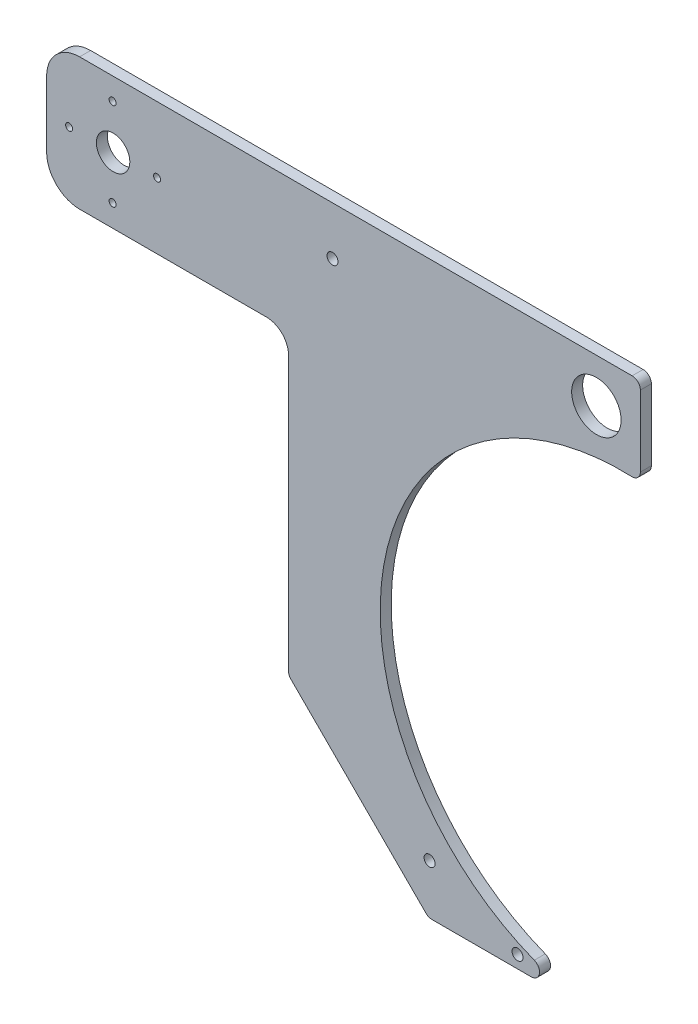
ISO-10303-21;
HEADER;
FILE_DESCRIPTION(('STEP AP214'),'2;1');
FILE_NAME('part.step','',(''),(''),'','','');
FILE_SCHEMA(('AUTOMOTIVE_DESIGN { 1 0 10303 214 1 1 1 1 }'));
ENDSEC;
DATA;
#1=APPLICATION_CONTEXT('core data for automotive mechanical design processes');
#2=APPLICATION_PROTOCOL_DEFINITION('international standard','automotive_design',2000,#1);
#3=PRODUCT_CONTEXT('',#1,'mechanical');
#4=PRODUCT('Part','Part','',(#3));
#5=PRODUCT_RELATED_PRODUCT_CATEGORY('part','',(#4));
#6=PRODUCT_DEFINITION_FORMATION('','',#4);
#7=PRODUCT_DEFINITION_CONTEXT('part definition',#1,'design');
#8=PRODUCT_DEFINITION('design','',#6,#7);
#9=PRODUCT_DEFINITION_SHAPE('','',#8);
#10=(LENGTH_UNIT() NAMED_UNIT(*) SI_UNIT(.MILLI.,.METRE.));
#11=(NAMED_UNIT(*) PLANE_ANGLE_UNIT() SI_UNIT($,.RADIAN.));
#12=(NAMED_UNIT(*) SI_UNIT($,.STERADIAN.) SOLID_ANGLE_UNIT());
#13=UNCERTAINTY_MEASURE_WITH_UNIT(LENGTH_MEASURE(1.E-05),#10,'distance_accuracy_value','');
#14=(GEOMETRIC_REPRESENTATION_CONTEXT(3) GLOBAL_UNCERTAINTY_ASSIGNED_CONTEXT((#13)) GLOBAL_UNIT_ASSIGNED_CONTEXT((#10,
#11,#12)) REPRESENTATION_CONTEXT('',''));
#15=CARTESIAN_POINT('',(0.,0.,0.));
#16=DIRECTION('',(0.,0.,1.));
#17=DIRECTION('',(1.,0.,0.));
#18=AXIS2_PLACEMENT_3D('',#15,#16,#17);
#19=CARTESIAN_POINT('',(0.,248.92,6.35));
#20=DIRECTION('',(0.,1.,0.));
#21=DIRECTION('',(0.,0.,1.));
#22=AXIS2_PLACEMENT_3D('',#19,#20,#21);
#23=PLANE('',#22);
#24=DIRECTION('',(1.,0.,0.));
#25=VECTOR('',#24,1.);
#26=CARTESIAN_POINT('',(0.,248.92,0.));
#27=LINE('',#26,#25);
#28=CARTESIAN_POINT('',(-120.65,248.92,0.));
#29=VERTEX_POINT('',#28);
#30=CARTESIAN_POINT('',(198.4375,248.92,0.));
#31=VERTEX_POINT('',#30);
#32=EDGE_CURVE('E207',#29,#31,#27,.T.);
#33=ORIENTED_EDGE('',*,*,#32,.F.);
#34=DIRECTION('',(0.,0.,-1.));
#35=VECTOR('',#34,1.);
#36=CARTESIAN_POINT('',(-120.65,248.92,6.35));
#37=LINE('',#36,#35);
#38=CARTESIAN_POINT('',(-120.65,248.92,6.35));
#39=VERTEX_POINT('',#38);
#40=EDGE_CURVE('E11',#39,#29,#37,.T.);
#41=ORIENTED_EDGE('',*,*,#40,.F.);
#42=DIRECTION('',(1.,0.,0.));
#43=VECTOR('',#42,1.);
#44=CARTESIAN_POINT('',(0.,248.92,6.35));
#45=LINE('',#44,#43);
#46=CARTESIAN_POINT('',(198.4375,248.92,6.35));
#47=VERTEX_POINT('',#46);
#48=EDGE_CURVE('E328',#39,#47,#45,.T.);
#49=ORIENTED_EDGE('',*,*,#48,.T.);
#50=DIRECTION('',(0.,0.,-1.));
#51=VECTOR('',#50,1.);
#52=CARTESIAN_POINT('',(198.4375,248.92,6.35));
#53=LINE('',#52,#51);
#54=EDGE_CURVE('E112',#47,#31,#53,.T.);
#55=ORIENTED_EDGE('',*,*,#54,.T.);
#56=EDGE_LOOP('',(#33,#41,#49,#55));
#57=FACE_BOUND('',#56,.T.);
#58=ADVANCED_FACE('F37',(#57),#23,.T.);
#59=CARTESIAN_POINT('',(-120.65,229.87,6.35));
#60=DIRECTION('',(0.,0.,-1.));
#61=DIRECTION('',(-1.,0.,0.));
#62=AXIS2_PLACEMENT_3D('',#59,#60,#61);
#63=CYLINDRICAL_SURFACE('',#62,19.05);
#64=CARTESIAN_POINT('',(-120.65,229.87,0.));
#65=DIRECTION('',(0.,0.,1.));
#66=DIRECTION('',(1.,0.,0.));
#67=AXIS2_PLACEMENT_3D('',#64,#65,#66);
#68=CIRCLE('',#67,19.05);
#69=CARTESIAN_POINT('',(-139.7,229.87,0.));
#70=VERTEX_POINT('',#69);
#71=EDGE_CURVE('E210',#29,#70,#68,.T.);
#72=ORIENTED_EDGE('',*,*,#71,.T.);
#73=DIRECTION('',(0.,0.,-1.));
#74=VECTOR('',#73,1.);
#75=CARTESIAN_POINT('',(-139.7,229.87,6.35));
#76=LINE('',#75,#74);
#77=CARTESIAN_POINT('',(-139.7,229.87,6.35));
#78=VERTEX_POINT('',#77);
#79=EDGE_CURVE('E46',#78,#70,#76,.T.);
#80=ORIENTED_EDGE('',*,*,#79,.F.);
#81=CARTESIAN_POINT('',(-120.65,229.87,6.35));
#82=DIRECTION('',(0.,0.,1.));
#83=DIRECTION('',(1.,0.,0.));
#84=AXIS2_PLACEMENT_3D('',#81,#82,#83);
#85=CIRCLE('',#84,19.05);
#86=EDGE_CURVE('E326',#39,#78,#85,.T.);
#87=ORIENTED_EDGE('',*,*,#86,.F.);
#88=ORIENTED_EDGE('',*,*,#40,.T.);
#89=EDGE_LOOP('',(#72,#80,#87,#88));
#90=FACE_BOUND('',#89,.T.);
#91=ADVANCED_FACE('F311',(#90),#63,.T.);
#92=CARTESIAN_POINT('',(-139.7,0.,6.35));
#93=DIRECTION('',(-1.,0.,0.));
#94=DIRECTION('',(0.,0.,1.));
#95=AXIS2_PLACEMENT_3D('',#92,#93,#94);
#96=PLANE('',#95);
#97=DIRECTION('',(0.,1.,0.));
#98=VECTOR('',#97,1.);
#99=CARTESIAN_POINT('',(-139.7,0.,0.));
#100=LINE('',#99,#98);
#101=CARTESIAN_POINT('',(-139.7,191.77,0.));
#102=VERTEX_POINT('',#101);
#103=EDGE_CURVE('E213',#102,#70,#100,.T.);
#104=ORIENTED_EDGE('',*,*,#103,.F.);
#105=DIRECTION('',(0.,0.,-1.));
#106=VECTOR('',#105,1.);
#107=CARTESIAN_POINT('',(-139.7,191.77,6.35));
#108=LINE('',#107,#106);
#109=CARTESIAN_POINT('',(-139.7,191.77,6.35));
#110=VERTEX_POINT('',#109);
#111=EDGE_CURVE('E301',#110,#102,#108,.T.);
#112=ORIENTED_EDGE('',*,*,#111,.F.);
#113=DIRECTION('',(0.,1.,0.));
#114=VECTOR('',#113,1.);
#115=CARTESIAN_POINT('',(-139.7,0.,6.35));
#116=LINE('',#115,#114);
#117=EDGE_CURVE('E308',#110,#78,#116,.T.);
#118=ORIENTED_EDGE('',*,*,#117,.T.);
#119=ORIENTED_EDGE('',*,*,#79,.T.);
#120=EDGE_LOOP('',(#104,#112,#118,#119));
#121=FACE_BOUND('',#120,.T.);
#122=ADVANCED_FACE('F306',(#121),#96,.T.);
#123=CARTESIAN_POINT('',(-120.65,191.77,6.35));
#124=DIRECTION('',(0.,0.,-1.));
#125=DIRECTION('',(-1.,0.,0.));
#126=AXIS2_PLACEMENT_3D('',#123,#124,#125);
#127=CYLINDRICAL_SURFACE('',#126,19.05);
#128=CARTESIAN_POINT('',(-120.65,191.77,0.));
#129=DIRECTION('',(0.,0.,1.));
#130=DIRECTION('',(1.,0.,0.));
#131=AXIS2_PLACEMENT_3D('',#128,#129,#130);
#132=CIRCLE('',#131,19.05);
#133=CARTESIAN_POINT('',(-120.65,172.72,0.));
#134=VERTEX_POINT('',#133);
#135=EDGE_CURVE('E216',#102,#134,#132,.T.);
#136=ORIENTED_EDGE('',*,*,#135,.T.);
#137=DIRECTION('',(0.,0.,-1.));
#138=VECTOR('',#137,1.);
#139=CARTESIAN_POINT('',(-120.65,172.72,6.35));
#140=LINE('',#139,#138);
#141=CARTESIAN_POINT('',(-120.65,172.72,6.35));
#142=VERTEX_POINT('',#141);
#143=EDGE_CURVE('E299',#142,#134,#140,.T.);
#144=ORIENTED_EDGE('',*,*,#143,.F.);
#145=CARTESIAN_POINT('',(-120.65,191.77,6.35));
#146=DIRECTION('',(0.,0.,1.));
#147=DIRECTION('',(1.,0.,0.));
#148=AXIS2_PLACEMENT_3D('',#145,#146,#147);
#149=CIRCLE('',#148,19.05);
#150=EDGE_CURVE('E322',#110,#142,#149,.T.);
#151=ORIENTED_EDGE('',*,*,#150,.F.);
#152=ORIENTED_EDGE('',*,*,#111,.T.);
#153=EDGE_LOOP('',(#136,#144,#151,#152));
#154=FACE_BOUND('',#153,.T.);
#155=ADVANCED_FACE('F319',(#154),#127,.T.);
#156=CARTESIAN_POINT('',(0.,172.72,6.35));
#157=DIRECTION('',(0.,-1.,0.));
#158=DIRECTION('',(0.,0.,-1.));
#159=AXIS2_PLACEMENT_3D('',#156,#157,#158);
#160=PLANE('',#159);
#161=DIRECTION('',(-1.,0.,0.));
#162=VECTOR('',#161,1.);
#163=CARTESIAN_POINT('',(0.,172.72,0.));
#164=LINE('',#163,#162);
#165=CARTESIAN_POINT('',(-12.7,172.72,0.));
#166=VERTEX_POINT('',#165);
#167=EDGE_CURVE('E219',#166,#134,#164,.T.);
#168=ORIENTED_EDGE('',*,*,#167,.F.);
#169=DIRECTION('',(0.,0.,-1.));
#170=VECTOR('',#169,1.);
#171=CARTESIAN_POINT('',(-12.7,172.72,6.35));
#172=LINE('',#171,#170);
#173=CARTESIAN_POINT('',(-12.7,172.72,6.35));
#174=VERTEX_POINT('',#173);
#175=EDGE_CURVE('E297',#174,#166,#172,.T.);
#176=ORIENTED_EDGE('',*,*,#175,.F.);
#177=DIRECTION('',(-1.,0.,0.));
#178=VECTOR('',#177,1.);
#179=CARTESIAN_POINT('',(0.,172.72,6.35));
#180=LINE('',#179,#178);
#181=EDGE_CURVE('E324',#174,#142,#180,.T.);
#182=ORIENTED_EDGE('',*,*,#181,.T.);
#183=ORIENTED_EDGE('',*,*,#143,.T.);
#184=EDGE_LOOP('',(#168,#176,#182,#183));
#185=FACE_BOUND('',#184,.T.);
#186=ADVANCED_FACE('F386',(#185),#160,.T.);
#187=CARTESIAN_POINT('',(-12.7,160.02,6.35));
#188=DIRECTION('',(0.,0.,-1.));
#189=DIRECTION('',(-1.,0.,0.));
#190=AXIS2_PLACEMENT_3D('',#187,#188,#189);
#191=CYLINDRICAL_SURFACE('',#190,12.7);
#192=CARTESIAN_POINT('',(-12.7,160.02,0.));
#193=DIRECTION('',(0.,0.,1.));
#194=DIRECTION('',(1.,0.,0.));
#195=AXIS2_PLACEMENT_3D('',#192,#193,#194);
#196=CIRCLE('',#195,12.7);
#197=CARTESIAN_POINT('',(0.,160.02,0.));
#198=VERTEX_POINT('',#197);
#199=EDGE_CURVE('E222',#198,#166,#196,.T.);
#200=ORIENTED_EDGE('',*,*,#199,.F.);
#201=DIRECTION('',(0.,0.,-1.));
#202=VECTOR('',#201,1.);
#203=CARTESIAN_POINT('',(0.,160.02,6.35));
#204=LINE('',#203,#202);
#205=CARTESIAN_POINT('',(0.,160.02,6.35));
#206=VERTEX_POINT('',#205);
#207=EDGE_CURVE('E295',#206,#198,#204,.T.);
#208=ORIENTED_EDGE('',*,*,#207,.F.);
#209=CARTESIAN_POINT('',(-12.7,160.02,6.35));
#210=DIRECTION('',(0.,0.,1.));
#211=DIRECTION('',(1.,0.,0.));
#212=AXIS2_PLACEMENT_3D('',#209,#210,#211);
#213=CIRCLE('',#212,12.7);
#214=EDGE_CURVE('E333',#206,#174,#213,.T.);
#215=ORIENTED_EDGE('',*,*,#214,.T.);
#216=ORIENTED_EDGE('',*,*,#175,.T.);
#217=EDGE_LOOP('',(#200,#208,#215,#216));
#218=FACE_BOUND('',#217,.T.);
#219=ADVANCED_FACE('F389',(#218),#191,.F.);
#220=CARTESIAN_POINT('',(0.,0.,6.35));
#221=DIRECTION('',(-1.,0.,0.));
#222=DIRECTION('',(0.,0.,1.));
#223=AXIS2_PLACEMENT_3D('',#220,#221,#222);
#224=PLANE('',#223);
#225=DIRECTION('',(0.,1.,0.));
#226=VECTOR('',#225,1.);
#227=CARTESIAN_POINT('',(0.,0.,0.));
#228=LINE('',#227,#226);
#229=CARTESIAN_POINT('',(0.,1.97269209080185,0.));
#230=VERTEX_POINT('',#229);
#231=EDGE_CURVE('E225',#230,#198,#228,.T.);
#232=ORIENTED_EDGE('',*,*,#231,.F.);
#233=DIRECTION('',(0.,0.,-1.));
#234=VECTOR('',#233,1.);
#235=CARTESIAN_POINT('',(0.,1.97269209080185,6.35));
#236=LINE('',#235,#234);
#237=CARTESIAN_POINT('',(0.,1.97269209080185,6.35));
#238=VERTEX_POINT('',#237);
#239=EDGE_CURVE('E293',#238,#230,#236,.T.);
#240=ORIENTED_EDGE('',*,*,#239,.F.);
#241=DIRECTION('',(0.,1.,0.));
#242=VECTOR('',#241,1.);
#243=CARTESIAN_POINT('',(0.,0.,6.35));
#244=LINE('',#243,#242);
#245=EDGE_CURVE('E336',#238,#206,#244,.T.);
#246=ORIENTED_EDGE('',*,*,#245,.T.);
#247=ORIENTED_EDGE('',*,*,#207,.T.);
#248=EDGE_LOOP('',(#232,#240,#246,#247));
#249=FACE_BOUND('',#248,.T.);
#250=ADVANCED_FACE('F393',(#249),#224,.T.);
#251=CARTESIAN_POINT('',(4.7625,1.97269209080185,6.35));
#252=DIRECTION('',(0.,0.,-1.));
#253=DIRECTION('',(-1.,0.,0.));
#254=AXIS2_PLACEMENT_3D('',#251,#252,#253);
#255=CYLINDRICAL_SURFACE('',#254,4.7625);
#256=CARTESIAN_POINT('',(4.7625,1.97269209080185,0.));
#257=DIRECTION('',(0.,0.,1.));
#258=DIRECTION('',(1.,0.,0.));
#259=AXIS2_PLACEMENT_3D('',#256,#257,#258);
#260=CIRCLE('',#259,4.7625);
#261=CARTESIAN_POINT('',(1.39490395459905,-1.39490395459906,0.));
#262=VERTEX_POINT('',#261);
#263=EDGE_CURVE('E228',#262,#230,#260,.F.);
#264=ORIENTED_EDGE('',*,*,#263,.F.);
#265=DIRECTION('',(0.,0.,-1.));
#266=VECTOR('',#265,1.);
#267=CARTESIAN_POINT('',(1.39490395459905,-1.39490395459906,6.35));
#268=LINE('',#267,#266);
#269=CARTESIAN_POINT('',(1.39490395459905,-1.39490395459906,6.35));
#270=VERTEX_POINT('',#269);
#271=EDGE_CURVE('E291',#270,#262,#268,.T.);
#272=ORIENTED_EDGE('',*,*,#271,.F.);
#273=CARTESIAN_POINT('',(4.7625,1.97269209080185,6.35));
#274=DIRECTION('',(0.,0.,1.));
#275=DIRECTION('',(1.,0.,0.));
#276=AXIS2_PLACEMENT_3D('',#273,#274,#275);
#277=CIRCLE('',#276,4.7625);
#278=EDGE_CURVE('E339',#270,#238,#277,.F.);
#279=ORIENTED_EDGE('',*,*,#278,.T.);
#280=ORIENTED_EDGE('',*,*,#239,.T.);
#281=EDGE_LOOP('',(#264,#272,#279,#280));
#282=FACE_BOUND('',#281,.T.);
#283=ADVANCED_FACE('F397',(#282),#255,.T.);
#284=CARTESIAN_POINT('',(0.,0.,6.35));
#285=DIRECTION('',(0.707106781186551,0.707106781186544,0.));
#286=DIRECTION('',(-0.707106781186544,0.707106781186551,0.));
#287=AXIS2_PLACEMENT_3D('',#284,#285,#286);
#288=PLANE('',#287);
#289=DIRECTION('',(0.707106781186544,-0.707106781186551,0.));
#290=VECTOR('',#289,1.);
#291=CARTESIAN_POINT('',(0.,0.,0.));
#292=LINE('',#291,#290);
#293=CARTESIAN_POINT('',(79.4274011350229,-79.4274011350237,0.));
#294=VERTEX_POINT('',#293);
#295=EDGE_CURVE('E231',#262,#294,#292,.T.);
#296=ORIENTED_EDGE('',*,*,#295,.T.);
#297=DIRECTION('',(0.,0.,-1.));
#298=VECTOR('',#297,1.);
#299=CARTESIAN_POINT('',(79.4274011350229,-79.4274011350237,6.35));
#300=LINE('',#299,#298);
#301=CARTESIAN_POINT('',(79.4274011350229,-79.4274011350237,6.35));
#302=VERTEX_POINT('',#301);
#303=EDGE_CURVE('E288',#302,#294,#300,.T.);
#304=ORIENTED_EDGE('',*,*,#303,.F.);
#305=DIRECTION('',(0.707106781186544,-0.707106781186551,0.));
#306=VECTOR('',#305,1.);
#307=CARTESIAN_POINT('',(0.,0.,6.35));
#308=LINE('',#307,#306);
#309=EDGE_CURVE('E342',#270,#302,#308,.T.);
#310=ORIENTED_EDGE('',*,*,#309,.F.);
#311=ORIENTED_EDGE('',*,*,#271,.T.);
#312=EDGE_LOOP('',(#296,#304,#310,#311));
#313=FACE_BOUND('',#312,.T.);
#314=ADVANCED_FACE('F401',(#313),#288,.F.);
#315=CARTESIAN_POINT('',(82.7949971804238,-76.0598050896228,6.35));
#316=DIRECTION('',(0.,0.,-1.));
#317=DIRECTION('',(-1.,0.,0.));
#318=AXIS2_PLACEMENT_3D('',#315,#316,#317);
#319=CYLINDRICAL_SURFACE('',#318,4.76250000000001);
#320=CARTESIAN_POINT('',(82.7949971804238,-76.0598050896228,0.));
#321=DIRECTION('',(0.,0.,1.));
#322=DIRECTION('',(1.,0.,0.));
#323=AXIS2_PLACEMENT_3D('',#320,#321,#322);
#324=CIRCLE('',#323,4.76250000000001);
#325=CARTESIAN_POINT('',(82.7949971804238,-80.8223050896228,0.));
#326=VERTEX_POINT('',#325);
#327=EDGE_CURVE('E234',#294,#326,#324,.T.);
#328=ORIENTED_EDGE('',*,*,#327,.T.);
#329=DIRECTION('',(0.,0.,-1.));
#330=VECTOR('',#329,1.);
#331=CARTESIAN_POINT('',(82.7949971804238,-80.8223050896228,6.35));
#332=LINE('',#331,#330);
#333=CARTESIAN_POINT('',(82.7949971804238,-80.8223050896228,6.35));
#334=VERTEX_POINT('',#333);
#335=EDGE_CURVE('E285',#334,#326,#332,.T.);
#336=ORIENTED_EDGE('',*,*,#335,.F.);
#337=CARTESIAN_POINT('',(82.7949971804238,-76.0598050896228,6.35));
#338=DIRECTION('',(0.,0.,1.));
#339=DIRECTION('',(1.,0.,0.));
#340=AXIS2_PLACEMENT_3D('',#337,#338,#339);
#341=CIRCLE('',#340,4.76250000000001);
#342=EDGE_CURVE('E345',#302,#334,#341,.T.);
#343=ORIENTED_EDGE('',*,*,#342,.F.);
#344=ORIENTED_EDGE('',*,*,#303,.T.);
#345=EDGE_LOOP('',(#328,#336,#343,#344));
#346=FACE_BOUND('',#345,.T.);
#347=ADVANCED_FACE('F405',(#346),#319,.T.);
#348=CARTESIAN_POINT('',(0.,-80.8223050896228,6.35));
#349=DIRECTION('',(0.,1.,0.));
#350=DIRECTION('',(0.,0.,1.));
#351=AXIS2_PLACEMENT_3D('',#348,#349,#350);
#352=PLANE('',#351);
#353=DIRECTION('',(1.,0.,0.));
#354=VECTOR('',#353,1.);
#355=CARTESIAN_POINT('',(0.,-80.8223050896228,0.));
#356=LINE('',#355,#354);
#357=CARTESIAN_POINT('',(140.194292931709,-80.8223050896228,0.));
#358=VERTEX_POINT('',#357);
#359=EDGE_CURVE('E237',#326,#358,#356,.T.);
#360=ORIENTED_EDGE('',*,*,#359,.T.);
#361=DIRECTION('',(0.,0.,-1.));
#362=VECTOR('',#361,1.);
#363=CARTESIAN_POINT('',(140.194292931709,-80.8223050896228,6.35));
#364=LINE('',#363,#362);
#365=CARTESIAN_POINT('',(140.194292931709,-80.8223050896228,6.35));
#366=VERTEX_POINT('',#365);
#367=EDGE_CURVE('E282',#366,#358,#364,.T.);
#368=ORIENTED_EDGE('',*,*,#367,.F.);
#369=DIRECTION('',(1.,0.,0.));
#370=VECTOR('',#369,1.);
#371=CARTESIAN_POINT('',(0.,-80.8223050896228,6.35));
#372=LINE('',#371,#370);
#373=EDGE_CURVE('E348',#334,#366,#372,.T.);
#374=ORIENTED_EDGE('',*,*,#373,.F.);
#375=ORIENTED_EDGE('',*,*,#335,.T.);
#376=EDGE_LOOP('',(#360,#368,#374,#375));
#377=FACE_BOUND('',#376,.T.);
#378=ADVANCED_FACE('F409',(#377),#352,.F.);
#379=CARTESIAN_POINT('',(140.194292931709,-76.0598050896228,6.35));
#380=DIRECTION('',(0.,0.,-1.));
#381=DIRECTION('',(-1.,0.,0.));
#382=AXIS2_PLACEMENT_3D('',#379,#380,#381);
#383=CYLINDRICAL_SURFACE('',#382,4.76250000000001);
#384=CARTESIAN_POINT('',(140.194292931709,-76.0598050896228,0.));
#385=DIRECTION('',(0.,0.,1.));
#386=DIRECTION('',(1.,0.,0.));
#387=AXIS2_PLACEMENT_3D('',#384,#385,#386);
#388=CIRCLE('',#387,4.76250000000001);
#389=CARTESIAN_POINT('',(141.927025129819,-71.6236980823884,0.));
#390=VERTEX_POINT('',#389);
#391=EDGE_CURVE('E240',#358,#390,#388,.T.);
#392=ORIENTED_EDGE('',*,*,#391,.T.);
#393=DIRECTION('',(0.,0.,-1.));
#394=VECTOR('',#393,1.);
#395=CARTESIAN_POINT('',(141.927025129819,-71.6236980823884,6.35));
#396=LINE('',#395,#394);
#397=CARTESIAN_POINT('',(141.927025129819,-71.6236980823884,6.35));
#398=VERTEX_POINT('',#397);
#399=EDGE_CURVE('E279',#398,#390,#396,.T.);
#400=ORIENTED_EDGE('',*,*,#399,.F.);
#401=CARTESIAN_POINT('',(140.194292931709,-76.0598050896228,6.35));
#402=DIRECTION('',(0.,0.,1.));
#403=DIRECTION('',(1.,0.,0.));
#404=AXIS2_PLACEMENT_3D('',#401,#402,#403);
#405=CIRCLE('',#404,4.76250000000001);
#406=EDGE_CURVE('E351',#366,#398,#405,.T.);
#407=ORIENTED_EDGE('',*,*,#406,.F.);
#408=ORIENTED_EDGE('',*,*,#367,.T.);
#409=EDGE_LOOP('',(#392,#400,#407,#408));
#410=FACE_BOUND('',#409,.T.);
#411=ADVANCED_FACE('F355',(#410),#383,.T.);
#412=CARTESIAN_POINT('',(192.811152544811,58.6488474551886,6.35));
#413=DIRECTION('',(0.,0.,-1.));
#414=DIRECTION('',(-1.,0.,0.));
#415=AXIS2_PLACEMENT_3D('',#412,#413,#414);
#416=CYLINDRICAL_SURFACE('',#415,139.857536599303);
#417=CARTESIAN_POINT('',(192.811152544811,58.6488474551886,0.));
#418=DIRECTION('',(0.,0.,1.));
#419=DIRECTION('',(1.,0.,0.));
#420=AXIS2_PLACEMENT_3D('',#417,#418,#419);
#421=CIRCLE('',#420,139.857536599303);
#422=CARTESIAN_POINT('',(198.252218068219,198.400503436773,0.));
#423=VERTEX_POINT('',#422);
#424=EDGE_CURVE('E243',#390,#423,#421,.F.);
#425=ORIENTED_EDGE('',*,*,#424,.T.);
#426=DIRECTION('',(0.,0.,-1.));
#427=VECTOR('',#426,1.);
#428=CARTESIAN_POINT('',(198.252218068219,198.400503436773,6.35));
#429=LINE('',#428,#427);
#430=CARTESIAN_POINT('',(198.252218068219,198.400503436773,6.35));
#431=VERTEX_POINT('',#430);
#432=EDGE_CURVE('E173',#431,#423,#429,.T.);
#433=ORIENTED_EDGE('',*,*,#432,.F.);
#434=CARTESIAN_POINT('',(192.811152544811,58.6488474551886,6.35));
#435=DIRECTION('',(0.,0.,1.));
#436=DIRECTION('',(1.,0.,0.));
#437=AXIS2_PLACEMENT_3D('',#434,#435,#436);
#438=CIRCLE('',#437,139.857536599303);
#439=EDGE_CURVE('E161',#398,#431,#438,.F.);
#440=ORIENTED_EDGE('',*,*,#439,.F.);
#441=ORIENTED_EDGE('',*,*,#399,.T.);
#442=EDGE_LOOP('',(#425,#433,#440,#441));
#443=FACE_BOUND('',#442,.T.);
#444=ADVANCED_FACE('F357',(#443),#416,.F.);
#445=CARTESIAN_POINT('',(198.4375,203.159397936104,6.35));
#446=DIRECTION('',(0.,0.,-1.));
#447=DIRECTION('',(-1.,0.,0.));
#448=AXIS2_PLACEMENT_3D('',#445,#446,#447);
#449=CYLINDRICAL_SURFACE('',#448,4.76250000000001);
#450=CARTESIAN_POINT('',(198.4375,203.159397936104,0.));
#451=DIRECTION('',(0.,0.,1.));
#452=DIRECTION('',(1.,0.,0.));
#453=AXIS2_PLACEMENT_3D('',#450,#451,#452);
#454=CIRCLE('',#453,4.76250000000001);
#455=CARTESIAN_POINT('',(203.2,203.159397936104,0.));
#456=VERTEX_POINT('',#455);
#457=EDGE_CURVE('E169',#423,#456,#454,.T.);
#458=ORIENTED_EDGE('',*,*,#457,.T.);
#459=DIRECTION('',(0.,0.,-1.));
#460=VECTOR('',#459,1.);
#461=CARTESIAN_POINT('',(203.2,203.159397936104,6.35));
#462=LINE('',#461,#460);
#463=CARTESIAN_POINT('',(203.2,203.159397936104,6.35));
#464=VERTEX_POINT('',#463);
#465=EDGE_CURVE('E167',#464,#456,#462,.T.);
#466=ORIENTED_EDGE('',*,*,#465,.F.);
#467=CARTESIAN_POINT('',(198.4375,203.159397936104,6.35));
#468=DIRECTION('',(0.,0.,1.));
#469=DIRECTION('',(1.,0.,0.));
#470=AXIS2_PLACEMENT_3D('',#467,#468,#469);
#471=CIRCLE('',#470,4.76250000000001);
#472=EDGE_CURVE('E154',#431,#464,#471,.T.);
#473=ORIENTED_EDGE('',*,*,#472,.F.);
#474=ORIENTED_EDGE('',*,*,#432,.T.);
#475=EDGE_LOOP('',(#458,#466,#473,#474));
#476=FACE_BOUND('',#475,.T.);
#477=ADVANCED_FACE('F168',(#476),#449,.T.);
#478=CARTESIAN_POINT('',(203.2,0.,6.35));
#479=DIRECTION('',(1.,0.,0.));
#480=DIRECTION('',(0.,0.,-1.));
#481=AXIS2_PLACEMENT_3D('',#478,#479,#480);
#482=PLANE('',#481);
#483=DIRECTION('',(0.,-1.,0.));
#484=VECTOR('',#483,1.);
#485=CARTESIAN_POINT('',(203.2,0.,0.));
#486=LINE('',#485,#484);
#487=CARTESIAN_POINT('',(203.2,244.1575,0.));
#488=VERTEX_POINT('',#487);
#489=EDGE_CURVE('E247',#488,#456,#486,.T.);
#490=ORIENTED_EDGE('',*,*,#489,.F.);
#491=DIRECTION('',(0.,0.,-1.));
#492=VECTOR('',#491,1.);
#493=CARTESIAN_POINT('',(203.2,244.1575,6.35));
#494=LINE('',#493,#492);
#495=CARTESIAN_POINT('',(203.2,244.1575,6.35));
#496=VERTEX_POINT('',#495);
#497=EDGE_CURVE('E105',#496,#488,#494,.T.);
#498=ORIENTED_EDGE('',*,*,#497,.F.);
#499=DIRECTION('',(0.,-1.,0.));
#500=VECTOR('',#499,1.);
#501=CARTESIAN_POINT('',(203.2,0.,6.35));
#502=LINE('',#501,#500);
#503=EDGE_CURVE('E159',#496,#464,#502,.T.);
#504=ORIENTED_EDGE('',*,*,#503,.T.);
#505=ORIENTED_EDGE('',*,*,#465,.T.);
#506=EDGE_LOOP('',(#490,#498,#504,#505));
#507=FACE_BOUND('',#506,.T.);
#508=ADVANCED_FACE('F175',(#507),#482,.T.);
#509=CARTESIAN_POINT('',(-75.911264173736,210.821094088903,6.35));
#510=DIRECTION('',(0.,0.,-1.));
#511=DIRECTION('',(-1.,0.,0.));
#512=AXIS2_PLACEMENT_3D('',#509,#510,#511);
#513=CYLINDRICAL_SURFACE('',#512,2.032);
#514=CARTESIAN_POINT('',(-75.911264173736,210.821094088903,6.35));
#515=DIRECTION('',(0.,0.,1.));
#516=DIRECTION('',(1.,0.,0.));
#517=AXIS2_PLACEMENT_3D('',#514,#515,#516);
#518=CIRCLE('',#517,2.032);
#519=CARTESIAN_POINT('',(-73.879264173736,210.821094088903,6.35));
#520=VERTEX_POINT('',#519);
#521=EDGE_CURVE('E198',#520,#520,#518,.T.);
#522=ORIENTED_EDGE('',*,*,#521,.T.);
#523=EDGE_LOOP('',(#522));
#524=FACE_BOUND('',#523,.T.);
#525=CARTESIAN_POINT('',(-75.911264173736,210.821094088903,0.));
#526=DIRECTION('',(0.,0.,1.));
#527=DIRECTION('',(1.,0.,0.));
#528=AXIS2_PLACEMENT_3D('',#525,#526,#527);
#529=CIRCLE('',#528,2.032);
#530=CARTESIAN_POINT('',(-73.879264173736,210.821094088903,0.));
#531=VERTEX_POINT('',#530);
#532=EDGE_CURVE('E269',#531,#531,#529,.T.);
#533=ORIENTED_EDGE('',*,*,#532,.F.);
#534=EDGE_LOOP('',(#533));
#535=FACE_BOUND('',#534,.T.);
#536=ADVANCED_FACE('F422',(#524,#535),#513,.F.);
#537=CARTESIAN_POINT('',(-101.311264173736,210.821094088903,6.35));
#538=DIRECTION('',(0.,0.,-1.));
#539=DIRECTION('',(-1.,0.,0.));
#540=AXIS2_PLACEMENT_3D('',#537,#538,#539);
#541=CYLINDRICAL_SURFACE('',#540,9.65199999999999);
#542=CARTESIAN_POINT('',(-101.311264173736,210.821094088903,6.35));
#543=DIRECTION('',(0.,0.,1.));
#544=DIRECTION('',(1.,0.,0.));
#545=AXIS2_PLACEMENT_3D('',#542,#543,#544);
#546=CIRCLE('',#545,9.65199999999999);
#547=CARTESIAN_POINT('',(-91.659264173736,210.821094088903,6.35));
#548=VERTEX_POINT('',#547);
#549=EDGE_CURVE('E195',#548,#548,#546,.T.);
#550=ORIENTED_EDGE('',*,*,#549,.T.);
#551=EDGE_LOOP('',(#550));
#552=FACE_BOUND('',#551,.T.);
#553=CARTESIAN_POINT('',(-101.311264173736,210.821094088903,0.));
#554=DIRECTION('',(0.,0.,1.));
#555=DIRECTION('',(1.,0.,0.));
#556=AXIS2_PLACEMENT_3D('',#553,#554,#555);
#557=CIRCLE('',#556,9.65199999999999);
#558=CARTESIAN_POINT('',(-91.659264173736,210.821094088903,0.));
#559=VERTEX_POINT('',#558);
#560=EDGE_CURVE('E266',#559,#559,#557,.T.);
#561=ORIENTED_EDGE('',*,*,#560,.F.);
#562=EDGE_LOOP('',(#561));
#563=FACE_BOUND('',#562,.T.);
#564=ADVANCED_FACE('F444',(#552,#563),#541,.F.);
#565=CARTESIAN_POINT('',(177.8,223.52,6.35));
#566=DIRECTION('',(0.,0.,-1.));
#567=DIRECTION('',(-1.,0.,0.));
#568=AXIS2_PLACEMENT_3D('',#565,#566,#567);
#569=CYLINDRICAL_SURFACE('',#568,14.2875);
#570=CARTESIAN_POINT('',(177.8,223.52,6.35));
#571=DIRECTION('',(0.,0.,1.));
#572=DIRECTION('',(1.,0.,0.));
#573=AXIS2_PLACEMENT_3D('',#570,#571,#572);
#574=CIRCLE('',#573,14.2875);
#575=CARTESIAN_POINT('',(192.0875,223.52,6.35));
#576=VERTEX_POINT('',#575);
#577=EDGE_CURVE('E192',#576,#576,#574,.T.);
#578=ORIENTED_EDGE('',*,*,#577,.T.);
#579=EDGE_LOOP('',(#578));
#580=FACE_BOUND('',#579,.T.);
#581=CARTESIAN_POINT('',(177.8,223.52,0.));
#582=DIRECTION('',(0.,0.,1.));
#583=DIRECTION('',(1.,0.,0.));
#584=AXIS2_PLACEMENT_3D('',#581,#582,#583);
#585=CIRCLE('',#584,14.2875);
#586=CARTESIAN_POINT('',(192.0875,223.52,0.));
#587=VERTEX_POINT('',#586);
#588=EDGE_CURVE('E263',#587,#587,#585,.T.);
#589=ORIENTED_EDGE('',*,*,#588,.F.);
#590=EDGE_LOOP('',(#589));
#591=FACE_BOUND('',#590,.T.);
#592=ADVANCED_FACE('F440',(#580,#591),#569,.F.);
#593=CARTESIAN_POINT('',(132.256792931709,-73.5198050896228,6.35));
#594=DIRECTION('',(0.,0.,-1.));
#595=DIRECTION('',(-1.,0.,0.));
#596=AXIS2_PLACEMENT_3D('',#593,#594,#595);
#597=CYLINDRICAL_SURFACE('',#596,3.17499999999999);
#598=CARTESIAN_POINT('',(132.256792931709,-73.5198050896228,6.35));
#599=DIRECTION('',(0.,0.,1.));
#600=DIRECTION('',(1.,0.,0.));
#601=AXIS2_PLACEMENT_3D('',#598,#599,#600);
#602=CIRCLE('',#601,3.17499999999999);
#603=CARTESIAN_POINT('',(135.431792931709,-73.5198050896228,6.35));
#604=VERTEX_POINT('',#603);
#605=EDGE_CURVE('E189',#604,#604,#602,.T.);
#606=ORIENTED_EDGE('',*,*,#605,.T.);
#607=EDGE_LOOP('',(#606));
#608=FACE_BOUND('',#607,.T.);
#609=CARTESIAN_POINT('',(132.256792931709,-73.5198050896228,0.));
#610=DIRECTION('',(0.,0.,1.));
#611=DIRECTION('',(1.,0.,0.));
#612=AXIS2_PLACEMENT_3D('',#609,#610,#611);
#613=CIRCLE('',#612,3.17499999999999);
#614=CARTESIAN_POINT('',(135.431792931709,-73.5198050896228,0.));
#615=VERTEX_POINT('',#614);
#616=EDGE_CURVE('E260',#615,#615,#613,.T.);
#617=ORIENTED_EDGE('',*,*,#616,.F.);
#618=EDGE_LOOP('',(#617));
#619=FACE_BOUND('',#618,.T.);
#620=ADVANCED_FACE('F436',(#608,#619),#597,.F.);
#621=CARTESIAN_POINT('',(81.4567929317091,-52.068737830312,6.35));
#622=DIRECTION('',(0.,0.,-1.));
#623=DIRECTION('',(-1.,0.,0.));
#624=AXIS2_PLACEMENT_3D('',#621,#622,#623);
#625=CYLINDRICAL_SURFACE('',#624,3.175);
#626=CARTESIAN_POINT('',(81.4567929317091,-52.068737830312,6.35));
#627=DIRECTION('',(0.,0.,1.));
#628=DIRECTION('',(1.,0.,0.));
#629=AXIS2_PLACEMENT_3D('',#626,#627,#628);
#630=CIRCLE('',#629,3.175);
#631=CARTESIAN_POINT('',(84.6317929317091,-52.068737830312,6.35));
#632=VERTEX_POINT('',#631);
#633=EDGE_CURVE('E186',#632,#632,#630,.T.);
#634=ORIENTED_EDGE('',*,*,#633,.T.);
#635=EDGE_LOOP('',(#634));
#636=FACE_BOUND('',#635,.T.);
#637=CARTESIAN_POINT('',(81.4567929317091,-52.068737830312,0.));
#638=DIRECTION('',(0.,0.,1.));
#639=DIRECTION('',(1.,0.,0.));
#640=AXIS2_PLACEMENT_3D('',#637,#638,#639);
#641=CIRCLE('',#640,3.175);
#642=CARTESIAN_POINT('',(84.6317929317091,-52.068737830312,0.));
#643=VERTEX_POINT('',#642);
#644=EDGE_CURVE('E257',#643,#643,#641,.T.);
#645=ORIENTED_EDGE('',*,*,#644,.F.);
#646=EDGE_LOOP('',(#645));
#647=FACE_BOUND('',#646,.T.);
#648=ADVANCED_FACE('F432',(#636,#647),#625,.F.);
#649=CARTESIAN_POINT('',(-101.6,236.221094088903,6.35));
#650=DIRECTION('',(0.,0.,-1.));
#651=DIRECTION('',(-1.,0.,0.));
#652=AXIS2_PLACEMENT_3D('',#649,#650,#651);
#653=CYLINDRICAL_SURFACE('',#652,2.032);
#654=CARTESIAN_POINT('',(-101.6,236.221094088903,6.35));
#655=DIRECTION('',(0.,0.,1.));
#656=DIRECTION('',(1.,0.,0.));
#657=AXIS2_PLACEMENT_3D('',#654,#655,#656);
#658=CIRCLE('',#657,2.032);
#659=CARTESIAN_POINT('',(-99.568,236.221094088903,6.35));
#660=VERTEX_POINT('',#659);
#661=EDGE_CURVE('E183',#660,#660,#658,.T.);
#662=ORIENTED_EDGE('',*,*,#661,.T.);
#663=EDGE_LOOP('',(#662));
#664=FACE_BOUND('',#663,.T.);
#665=CARTESIAN_POINT('',(-101.6,236.221094088903,0.));
#666=DIRECTION('',(0.,0.,1.));
#667=DIRECTION('',(1.,0.,0.));
#668=AXIS2_PLACEMENT_3D('',#665,#666,#667);
#669=CIRCLE('',#668,2.032);
#670=CARTESIAN_POINT('',(-99.568,236.221094088903,0.));
#671=VERTEX_POINT('',#670);
#672=EDGE_CURVE('E254',#671,#671,#669,.T.);
#673=ORIENTED_EDGE('',*,*,#672,.F.);
#674=EDGE_LOOP('',(#673));
#675=FACE_BOUND('',#674,.T.);
#676=ADVANCED_FACE('F428',(#664,#675),#653,.F.);
#677=CARTESIAN_POINT('',(-101.6,185.421094088903,6.35));
#678=DIRECTION('',(0.,0.,-1.));
#679=DIRECTION('',(-1.,0.,0.));
#680=AXIS2_PLACEMENT_3D('',#677,#678,#679);
#681=CYLINDRICAL_SURFACE('',#680,2.032);
#682=CARTESIAN_POINT('',(-101.6,185.421094088903,6.35));
#683=DIRECTION('',(0.,0.,1.));
#684=DIRECTION('',(1.,0.,0.));
#685=AXIS2_PLACEMENT_3D('',#682,#683,#684);
#686=CIRCLE('',#685,2.032);
#687=CARTESIAN_POINT('',(-99.568,185.421094088903,6.35));
#688=VERTEX_POINT('',#687);
#689=EDGE_CURVE('E177',#688,#688,#686,.T.);
#690=ORIENTED_EDGE('',*,*,#689,.T.);
#691=EDGE_LOOP('',(#690));
#692=FACE_BOUND('',#691,.T.);
#693=CARTESIAN_POINT('',(-101.6,185.421094088903,0.));
#694=DIRECTION('',(0.,0.,1.));
#695=DIRECTION('',(1.,0.,0.));
#696=AXIS2_PLACEMENT_3D('',#693,#694,#695);
#697=CIRCLE('',#696,2.032);
#698=CARTESIAN_POINT('',(-99.568,185.421094088903,0.));
#699=VERTEX_POINT('',#698);
#700=EDGE_CURVE('E251',#699,#699,#697,.T.);
#701=ORIENTED_EDGE('',*,*,#700,.F.);
#702=EDGE_LOOP('',(#701));
#703=FACE_BOUND('',#702,.T.);
#704=ADVANCED_FACE('F425',(#692,#703),#681,.F.);
#705=CARTESIAN_POINT('',(198.4375,244.1575,6.35));
#706=DIRECTION('',(0.,0.,-1.));
#707=DIRECTION('',(-1.,0.,0.));
#708=AXIS2_PLACEMENT_3D('',#705,#706,#707);
#709=CYLINDRICAL_SURFACE('',#708,4.7625);
#710=CARTESIAN_POINT('',(198.4375,244.1575,0.));
#711=DIRECTION('',(0.,0.,1.));
#712=DIRECTION('',(1.,0.,0.));
#713=AXIS2_PLACEMENT_3D('',#710,#711,#712);
#714=CIRCLE('',#713,4.7625);
#715=EDGE_CURVE('E249',#488,#31,#714,.T.);
#716=ORIENTED_EDGE('',*,*,#715,.T.);
#717=ORIENTED_EDGE('',*,*,#54,.F.);
#718=CARTESIAN_POINT('',(198.4375,244.1575,6.35));
#719=DIRECTION('',(0.,0.,1.));
#720=DIRECTION('',(1.,0.,0.));
#721=AXIS2_PLACEMENT_3D('',#718,#719,#720);
#722=CIRCLE('',#721,4.7625);
#723=EDGE_CURVE('E54',#496,#47,#722,.T.);
#724=ORIENTED_EDGE('',*,*,#723,.F.);
#725=ORIENTED_EDGE('',*,*,#497,.T.);
#726=EDGE_LOOP('',(#716,#717,#724,#725));
#727=FACE_BOUND('',#726,.T.);
#728=ADVANCED_FACE('F358',(#727),#709,.T.);
#729=CARTESIAN_POINT('',(25.4,220.98,6.35));
#730=DIRECTION('',(0.,0.,-1.));
#731=DIRECTION('',(-1.,0.,0.));
#732=AXIS2_PLACEMENT_3D('',#729,#730,#731);
#733=CYLINDRICAL_SURFACE('',#732,3.175);
#734=CARTESIAN_POINT('',(25.4,220.98,6.35));
#735=DIRECTION('',(0.,0.,1.));
#736=DIRECTION('',(1.,0.,0.));
#737=AXIS2_PLACEMENT_3D('',#734,#735,#736);
#738=CIRCLE('',#737,3.175);
#739=CARTESIAN_POINT('',(28.575,220.98,6.35));
#740=VERTEX_POINT('',#739);
#741=EDGE_CURVE('E275',#740,#740,#738,.T.);
#742=ORIENTED_EDGE('',*,*,#741,.T.);
#743=EDGE_LOOP('',(#742));
#744=FACE_BOUND('',#743,.T.);
#745=CARTESIAN_POINT('',(25.4,220.98,0.));
#746=DIRECTION('',(0.,0.,1.));
#747=DIRECTION('',(1.,0.,0.));
#748=AXIS2_PLACEMENT_3D('',#745,#746,#747);
#749=CIRCLE('',#748,3.175);
#750=CARTESIAN_POINT('',(28.575,220.98,0.));
#751=VERTEX_POINT('',#750);
#752=EDGE_CURVE('E204',#751,#751,#749,.T.);
#753=ORIENTED_EDGE('',*,*,#752,.F.);
#754=EDGE_LOOP('',(#753));
#755=FACE_BOUND('',#754,.T.);
#756=ADVANCED_FACE('F39',(#744,#755),#733,.F.);
#757=CARTESIAN_POINT('',(-126.711264173736,210.821094088903,6.35));
#758=DIRECTION('',(0.,0.,-1.));
#759=DIRECTION('',(-1.,0.,0.));
#760=AXIS2_PLACEMENT_3D('',#757,#758,#759);
#761=CYLINDRICAL_SURFACE('',#760,2.032);
#762=CARTESIAN_POINT('',(-126.711264173736,210.821094088903,6.35));
#763=DIRECTION('',(0.,0.,1.));
#764=DIRECTION('',(1.,0.,0.));
#765=AXIS2_PLACEMENT_3D('',#762,#763,#764);
#766=CIRCLE('',#765,2.032);
#767=CARTESIAN_POINT('',(-124.679264173736,210.821094088903,6.35));
#768=VERTEX_POINT('',#767);
#769=EDGE_CURVE('E201',#768,#768,#766,.F.);
#770=ORIENTED_EDGE('',*,*,#769,.F.);
#771=EDGE_LOOP('',(#770));
#772=FACE_BOUND('',#771,.T.);
#773=CARTESIAN_POINT('',(-126.711264173736,210.821094088903,0.));
#774=DIRECTION('',(0.,0.,1.));
#775=DIRECTION('',(1.,0.,0.));
#776=AXIS2_PLACEMENT_3D('',#773,#774,#775);
#777=CIRCLE('',#776,2.032);
#778=CARTESIAN_POINT('',(-124.679264173736,210.821094088903,0.));
#779=VERTEX_POINT('',#778);
#780=EDGE_CURVE('E272',#779,#779,#777,.F.);
#781=ORIENTED_EDGE('',*,*,#780,.T.);
#782=EDGE_LOOP('',(#781));
#783=FACE_BOUND('',#782,.T.);
#784=ADVANCED_FACE('F366',(#772,#783),#761,.F.);
#785=CARTESIAN_POINT('',(0.,0.,6.35));
#786=DIRECTION('',(0.,0.,1.));
#787=DIRECTION('',(1.,0.,0.));
#788=AXIS2_PLACEMENT_3D('',#785,#786,#787);
#789=PLANE('',#788);
#790=ORIENTED_EDGE('',*,*,#741,.F.);
#791=EDGE_LOOP('',(#790));
#792=FACE_BOUND('',#791,.T.);
#793=ORIENTED_EDGE('',*,*,#48,.F.);
#794=ORIENTED_EDGE('',*,*,#86,.T.);
#795=ORIENTED_EDGE('',*,*,#117,.F.);
#796=ORIENTED_EDGE('',*,*,#150,.T.);
#797=ORIENTED_EDGE('',*,*,#181,.F.);
#798=ORIENTED_EDGE('',*,*,#214,.F.);
#799=ORIENTED_EDGE('',*,*,#245,.F.);
#800=ORIENTED_EDGE('',*,*,#278,.F.);
#801=ORIENTED_EDGE('',*,*,#309,.T.);
#802=ORIENTED_EDGE('',*,*,#342,.T.);
#803=ORIENTED_EDGE('',*,*,#373,.T.);
#804=ORIENTED_EDGE('',*,*,#406,.T.);
#805=ORIENTED_EDGE('',*,*,#439,.T.);
#806=ORIENTED_EDGE('',*,*,#472,.T.);
#807=ORIENTED_EDGE('',*,*,#503,.F.);
#808=ORIENTED_EDGE('',*,*,#723,.T.);
#809=EDGE_LOOP('',(#793,#794,#795,#796,#797,#798,#799,#800,#801,#802,#803,#804,#805,#806,#807,#808));
#810=FACE_BOUND('',#809,.T.);
#811=ORIENTED_EDGE('',*,*,#689,.F.);
#812=EDGE_LOOP('',(#811));
#813=FACE_BOUND('',#812,.T.);
#814=ORIENTED_EDGE('',*,*,#661,.F.);
#815=EDGE_LOOP('',(#814));
#816=FACE_BOUND('',#815,.T.);
#817=ORIENTED_EDGE('',*,*,#633,.F.);
#818=EDGE_LOOP('',(#817));
#819=FACE_BOUND('',#818,.T.);
#820=ORIENTED_EDGE('',*,*,#605,.F.);
#821=EDGE_LOOP('',(#820));
#822=FACE_BOUND('',#821,.T.);
#823=ORIENTED_EDGE('',*,*,#577,.F.);
#824=EDGE_LOOP('',(#823));
#825=FACE_BOUND('',#824,.T.);
#826=ORIENTED_EDGE('',*,*,#549,.F.);
#827=EDGE_LOOP('',(#826));
#828=FACE_BOUND('',#827,.T.);
#829=ORIENTED_EDGE('',*,*,#521,.F.);
#830=EDGE_LOOP('',(#829));
#831=FACE_BOUND('',#830,.T.);
#832=ORIENTED_EDGE('',*,*,#769,.T.);
#833=EDGE_LOOP('',(#832));
#834=FACE_BOUND('',#833,.T.);
#835=ADVANCED_FACE('F156',(#792,#810,#813,#816,#819,#822,#825,#828,#831,#834),#789,.T.);
#836=CARTESIAN_POINT('',(0.,0.,0.));
#837=DIRECTION('',(0.,0.,1.));
#838=DIRECTION('',(1.,0.,0.));
#839=AXIS2_PLACEMENT_3D('',#836,#837,#838);
#840=PLANE('',#839);
#841=ORIENTED_EDGE('',*,*,#752,.T.);
#842=EDGE_LOOP('',(#841));
#843=FACE_BOUND('',#842,.T.);
#844=ORIENTED_EDGE('',*,*,#32,.T.);
#845=ORIENTED_EDGE('',*,*,#715,.F.);
#846=ORIENTED_EDGE('',*,*,#489,.T.);
#847=ORIENTED_EDGE('',*,*,#457,.F.);
#848=ORIENTED_EDGE('',*,*,#424,.F.);
#849=ORIENTED_EDGE('',*,*,#391,.F.);
#850=ORIENTED_EDGE('',*,*,#359,.F.);
#851=ORIENTED_EDGE('',*,*,#327,.F.);
#852=ORIENTED_EDGE('',*,*,#295,.F.);
#853=ORIENTED_EDGE('',*,*,#263,.T.);
#854=ORIENTED_EDGE('',*,*,#231,.T.);
#855=ORIENTED_EDGE('',*,*,#199,.T.);
#856=ORIENTED_EDGE('',*,*,#167,.T.);
#857=ORIENTED_EDGE('',*,*,#135,.F.);
#858=ORIENTED_EDGE('',*,*,#103,.T.);
#859=ORIENTED_EDGE('',*,*,#71,.F.);
#860=EDGE_LOOP('',(#844,#845,#846,#847,#848,#849,#850,#851,#852,#853,#854,#855,#856,#857,#858,#859));
#861=FACE_BOUND('',#860,.T.);
#862=ORIENTED_EDGE('',*,*,#700,.T.);
#863=EDGE_LOOP('',(#862));
#864=FACE_BOUND('',#863,.T.);
#865=ORIENTED_EDGE('',*,*,#672,.T.);
#866=EDGE_LOOP('',(#865));
#867=FACE_BOUND('',#866,.T.);
#868=ORIENTED_EDGE('',*,*,#644,.T.);
#869=EDGE_LOOP('',(#868));
#870=FACE_BOUND('',#869,.T.);
#871=ORIENTED_EDGE('',*,*,#616,.T.);
#872=EDGE_LOOP('',(#871));
#873=FACE_BOUND('',#872,.T.);
#874=ORIENTED_EDGE('',*,*,#588,.T.);
#875=EDGE_LOOP('',(#874));
#876=FACE_BOUND('',#875,.T.);
#877=ORIENTED_EDGE('',*,*,#560,.T.);
#878=EDGE_LOOP('',(#877));
#879=FACE_BOUND('',#878,.T.);
#880=ORIENTED_EDGE('',*,*,#532,.T.);
#881=EDGE_LOOP('',(#880));
#882=FACE_BOUND('',#881,.T.);
#883=ORIENTED_EDGE('',*,*,#780,.F.);
#884=EDGE_LOOP('',(#883));
#885=FACE_BOUND('',#884,.T.);
#886=ADVANCED_FACE('F314',(#843,#861,#864,#867,#870,#873,#876,#879,#882,#885),#840,.F.);
#887=CLOSED_SHELL('',(#58,#91,#122,#155,#186,#219,#250,#283,#314,#347,#378,#411,#444,#477,#508,
#536,#564,#592,#620,#648,#676,#704,#728,#756,#784,#835,#886));
#888=MANIFOLD_SOLID_BREP('B2',#887);
#889=ADVANCED_BREP_SHAPE_REPRESENTATION('',(#18,#888),#14);
#890=SHAPE_DEFINITION_REPRESENTATION(#9,#889);
ENDSEC;
END-ISO-10303-21;
